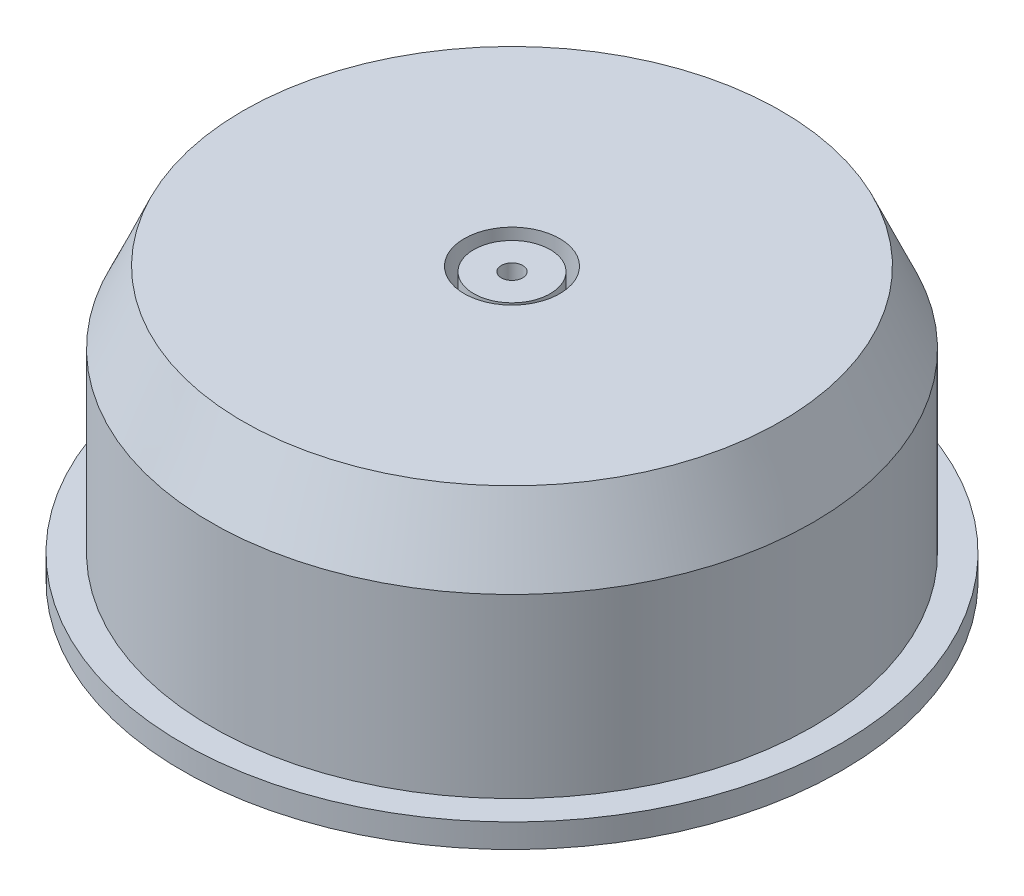
ISO-10303-21;
HEADER;
FILE_DESCRIPTION(('STEP AP214'),'2;1');
FILE_NAME('part.step','',(''),(''),'','','');
FILE_SCHEMA(('AUTOMOTIVE_DESIGN { 1 0 10303 214 1 1 1 1 }'));
ENDSEC;
DATA;
#1=APPLICATION_CONTEXT('core data for automotive mechanical design processes');
#2=APPLICATION_PROTOCOL_DEFINITION('international standard','automotive_design',2000,#1);
#3=PRODUCT_CONTEXT('',#1,'mechanical');
#4=PRODUCT('Part','Part','',(#3));
#5=PRODUCT_RELATED_PRODUCT_CATEGORY('part','',(#4));
#6=PRODUCT_DEFINITION_FORMATION('','',#4);
#7=PRODUCT_DEFINITION_CONTEXT('part definition',#1,'design');
#8=PRODUCT_DEFINITION('design','',#6,#7);
#9=PRODUCT_DEFINITION_SHAPE('','',#8);
#10=(LENGTH_UNIT() NAMED_UNIT(*) SI_UNIT(.MILLI.,.METRE.));
#11=(NAMED_UNIT(*) PLANE_ANGLE_UNIT() SI_UNIT($,.RADIAN.));
#12=(NAMED_UNIT(*) SI_UNIT($,.STERADIAN.) SOLID_ANGLE_UNIT());
#13=UNCERTAINTY_MEASURE_WITH_UNIT(LENGTH_MEASURE(1.E-05),#10,'distance_accuracy_value','');
#14=(GEOMETRIC_REPRESENTATION_CONTEXT(3) GLOBAL_UNCERTAINTY_ASSIGNED_CONTEXT((#13)) GLOBAL_UNIT_ASSIGNED_CONTEXT((#10,
#11,#12)) REPRESENTATION_CONTEXT('',''));
#15=CARTESIAN_POINT('',(0.,0.,0.));
#16=DIRECTION('',(0.,0.,1.));
#17=DIRECTION('',(1.,0.,0.));
#18=AXIS2_PLACEMENT_3D('',#15,#16,#17);
#19=CARTESIAN_POINT('',(0.,-1.97824676932213,0.));
#20=DIRECTION('',(0.,-1.,0.));
#21=DIRECTION('',(1.,0.,0.));
#22=AXIS2_PLACEMENT_3D('',#19,#20,#21);
#23=CONICAL_SURFACE('',#22,56.3333333333333,0.418224329579229);
#24=CARTESIAN_POINT('',(0.,-16.9782467693221,0.));
#25=DIRECTION('',(0.,1.,0.));
#26=DIRECTION('',(-1.,0.,0.));
#27=AXIS2_PLACEMENT_3D('',#24,#25,#26);
#28=CIRCLE('',#27,63.);
#29=CARTESIAN_POINT('',(-63.,-16.9782467693221,0.));
#30=VERTEX_POINT('',#29);
#31=EDGE_CURVE('E198',#30,#30,#28,.T.);
#32=ORIENTED_EDGE('',*,*,#31,.T.);
#33=EDGE_LOOP('',(#32));
#34=FACE_BOUND('',#33,.T.);
#35=CARTESIAN_POINT('',(0.,-1.97824676932213,0.));
#36=DIRECTION('',(0.,1.,0.));
#37=DIRECTION('',(-1.,0.,0.));
#38=AXIS2_PLACEMENT_3D('',#35,#36,#37);
#39=CIRCLE('',#38,56.3333333333333);
#40=CARTESIAN_POINT('',(-56.3333333333333,-1.97824676932213,0.));
#41=VERTEX_POINT('',#40);
#42=EDGE_CURVE('E168',#41,#41,#39,.T.);
#43=ORIENTED_EDGE('',*,*,#42,.F.);
#44=EDGE_LOOP('',(#43));
#45=FACE_BOUND('',#44,.T.);
#46=ADVANCED_FACE('F38',(#34,#45),#23,.T.);
#47=CARTESIAN_POINT('',(0.,-2.97824676932212,0.));
#48=DIRECTION('',(0.,1.,0.));
#49=DIRECTION('',(-1.,0.,0.));
#50=AXIS2_PLACEMENT_3D('',#47,#48,#49);
#51=CYLINDRICAL_SURFACE('',#50,63.);
#52=CARTESIAN_POINT('',(0.,-53.9782467693221,0.));
#53=DIRECTION('',(0.,1.,0.));
#54=DIRECTION('',(-1.,0.,0.));
#55=AXIS2_PLACEMENT_3D('',#52,#53,#54);
#56=CIRCLE('',#55,63.);
#57=CARTESIAN_POINT('',(-63.,-53.9782467693221,0.));
#58=VERTEX_POINT('',#57);
#59=EDGE_CURVE('E195',#58,#58,#56,.T.);
#60=ORIENTED_EDGE('',*,*,#59,.T.);
#61=EDGE_LOOP('',(#60));
#62=FACE_BOUND('',#61,.T.);
#63=ORIENTED_EDGE('',*,*,#31,.F.);
#64=EDGE_LOOP('',(#63));
#65=FACE_BOUND('',#64,.T.);
#66=ADVANCED_FACE('F220',(#62,#65),#51,.T.);
#67=CARTESIAN_POINT('',(-63.,-53.9782467693221,0.));
#68=DIRECTION('',(0.,1.,0.));
#69=DIRECTION('',(-1.,0.,0.));
#70=AXIS2_PLACEMENT_3D('',#67,#68,#69);
#71=PLANE('',#70);
#72=CARTESIAN_POINT('',(0.,-53.9782467693221,0.));
#73=DIRECTION('',(0.,1.,0.));
#74=DIRECTION('',(-1.,0.,0.));
#75=AXIS2_PLACEMENT_3D('',#72,#73,#74);
#76=CIRCLE('',#75,69.);
#77=CARTESIAN_POINT('',(-69.,-53.9782467693221,0.));
#78=VERTEX_POINT('',#77);
#79=EDGE_CURVE('E192',#78,#78,#76,.T.);
#80=ORIENTED_EDGE('',*,*,#79,.T.);
#81=EDGE_LOOP('',(#80));
#82=FACE_BOUND('',#81,.T.);
#83=ORIENTED_EDGE('',*,*,#59,.F.);
#84=EDGE_LOOP('',(#83));
#85=FACE_BOUND('',#84,.T.);
#86=ADVANCED_FACE('F225',(#82,#85),#71,.T.);
#87=CARTESIAN_POINT('',(0.,-2.97824676932212,0.));
#88=DIRECTION('',(0.,1.,0.));
#89=DIRECTION('',(-1.,0.,0.));
#90=AXIS2_PLACEMENT_3D('',#87,#88,#89);
#91=CYLINDRICAL_SURFACE('',#90,69.);
#92=CARTESIAN_POINT('',(0.,-58.9782467693221,0.));
#93=DIRECTION('',(0.,1.,0.));
#94=DIRECTION('',(-1.,0.,0.));
#95=AXIS2_PLACEMENT_3D('',#92,#93,#94);
#96=CIRCLE('',#95,69.);
#97=CARTESIAN_POINT('',(-69.,-58.9782467693221,0.));
#98=VERTEX_POINT('',#97);
#99=EDGE_CURVE('E189',#98,#98,#96,.T.);
#100=ORIENTED_EDGE('',*,*,#99,.T.);
#101=EDGE_LOOP('',(#100));
#102=FACE_BOUND('',#101,.T.);
#103=ORIENTED_EDGE('',*,*,#79,.F.);
#104=EDGE_LOOP('',(#103));
#105=FACE_BOUND('',#104,.T.);
#106=ADVANCED_FACE('F275',(#102,#105),#91,.T.);
#107=CARTESIAN_POINT('',(-69.,-58.9782467693221,0.));
#108=DIRECTION('',(0.,-1.,0.));
#109=DIRECTION('',(1.,0.,0.));
#110=AXIS2_PLACEMENT_3D('',#107,#108,#109);
#111=PLANE('',#110);
#112=CARTESIAN_POINT('',(51.3826826033579,-58.9782467693221,-31.0025831017987));
#113=DIRECTION('',(0.,-1.,0.));
#114=DIRECTION('',(0.,0.,-1.));
#115=AXIS2_PLACEMENT_3D('',#112,#113,#114);
#116=CIRCLE('',#115,5.2);
#117=CARTESIAN_POINT('',(51.3826826033579,-58.9782467693221,-36.2025831017987));
#118=VERTEX_POINT('',#117);
#119=EDGE_CURVE('E94',#118,#118,#116,.T.);
#120=ORIENTED_EDGE('',*,*,#119,.F.);
#121=EDGE_LOOP('',(#120));
#122=FACE_BOUND('',#121,.T.);
#123=CARTESIAN_POINT('',(52.5403658507747,-58.9782467693221,28.9974168982014));
#124=DIRECTION('',(0.,-1.,0.));
#125=DIRECTION('',(0.,0.,-1.));
#126=AXIS2_PLACEMENT_3D('',#123,#124,#125);
#127=CIRCLE('',#126,5.2);
#128=CARTESIAN_POINT('',(52.5403658507747,-58.9782467693221,23.7974168982014));
#129=VERTEX_POINT('',#128);
#130=EDGE_CURVE('E110',#129,#129,#127,.T.);
#131=ORIENTED_EDGE('',*,*,#130,.F.);
#132=EDGE_LOOP('',(#131));
#133=FACE_BOUND('',#132,.T.);
#134=CARTESIAN_POINT('',(1.15768324741619,-58.9782467693221,60.));
#135=DIRECTION('',(0.,-1.,0.));
#136=DIRECTION('',(0.,0.,-1.));
#137=AXIS2_PLACEMENT_3D('',#134,#135,#136);
#138=CIRCLE('',#137,5.2);
#139=CARTESIAN_POINT('',(1.15768324741619,-58.9782467693221,54.8));
#140=VERTEX_POINT('',#139);
#141=EDGE_CURVE('E119',#140,#140,#138,.T.);
#142=ORIENTED_EDGE('',*,*,#141,.F.);
#143=EDGE_LOOP('',(#142));
#144=FACE_BOUND('',#143,.T.);
#145=CARTESIAN_POINT('',(-51.3826826033581,-58.9782467693221,31.0025831017983));
#146=DIRECTION('',(0.,-1.,0.));
#147=DIRECTION('',(0.,0.,-1.));
#148=AXIS2_PLACEMENT_3D('',#145,#146,#147);
#149=CIRCLE('',#148,5.2);
#150=CARTESIAN_POINT('',(-51.3826826033581,-58.9782467693221,25.8025831017983));
#151=VERTEX_POINT('',#150);
#152=EDGE_CURVE('E128',#151,#151,#149,.T.);
#153=ORIENTED_EDGE('',*,*,#152,.F.);
#154=EDGE_LOOP('',(#153));
#155=FACE_BOUND('',#154,.T.);
#156=CARTESIAN_POINT('',(-52.5403658507745,-58.9782467693221,-28.9974168982018));
#157=DIRECTION('',(0.,-1.,0.));
#158=DIRECTION('',(0.,0.,-1.));
#159=AXIS2_PLACEMENT_3D('',#156,#157,#158);
#160=CIRCLE('',#159,5.2);
#161=CARTESIAN_POINT('',(-52.5403658507745,-58.9782467693221,-34.1974168982018));
#162=VERTEX_POINT('',#161);
#163=EDGE_CURVE('E137',#162,#162,#160,.T.);
#164=ORIENTED_EDGE('',*,*,#163,.F.);
#165=EDGE_LOOP('',(#164));
#166=FACE_BOUND('',#165,.T.);
#167=CARTESIAN_POINT('',(-1.15768324741619,-58.9782467693221,-60.));
#168=DIRECTION('',(0.,-1.,0.));
#169=DIRECTION('',(0.,0.,-1.));
#170=AXIS2_PLACEMENT_3D('',#167,#168,#169);
#171=CIRCLE('',#170,5.2);
#172=CARTESIAN_POINT('',(-1.15768324741619,-58.9782467693221,-65.2));
#173=VERTEX_POINT('',#172);
#174=EDGE_CURVE('E146',#173,#173,#171,.T.);
#175=ORIENTED_EDGE('',*,*,#174,.F.);
#176=EDGE_LOOP('',(#175));
#177=FACE_BOUND('',#176,.T.);
#178=CARTESIAN_POINT('',(0.,-58.9782467693221,0.));
#179=DIRECTION('',(0.,1.,0.));
#180=DIRECTION('',(-1.,0.,0.));
#181=AXIS2_PLACEMENT_3D('',#178,#179,#180);
#182=CIRCLE('',#181,34.2989447690252);
#183=CARTESIAN_POINT('',(-34.2989447690252,-58.9782467693221,0.));
#184=VERTEX_POINT('',#183);
#185=EDGE_CURVE('E186',#184,#184,#182,.T.);
#186=ORIENTED_EDGE('',*,*,#185,.T.);
#187=EDGE_LOOP('',(#186));
#188=FACE_BOUND('',#187,.T.);
#189=ORIENTED_EDGE('',*,*,#99,.F.);
#190=EDGE_LOOP('',(#189));
#191=FACE_BOUND('',#190,.T.);
#192=ADVANCED_FACE('F271',(#122,#133,#144,#155,#166,#177,#188,#191),#111,.T.);
#193=CARTESIAN_POINT('',(0.,-58.9782467693221,0.));
#194=DIRECTION('',(0.,1.,0.));
#195=DIRECTION('',(-1.,0.,0.));
#196=AXIS2_PLACEMENT_3D('',#193,#194,#195);
#197=CONICAL_SURFACE('',#196,34.2989447690252,1.15257199721567);
#198=CARTESIAN_POINT('',(0.,-62.9782467693221,0.));
#199=DIRECTION('',(0.,1.,0.));
#200=DIRECTION('',(-1.,0.,0.));
#201=AXIS2_PLACEMENT_3D('',#198,#199,#200);
#202=CIRCLE('',#201,25.2989447690253);
#203=CARTESIAN_POINT('',(-25.2989447690253,-62.9782467693221,0.));
#204=VERTEX_POINT('',#203);
#205=EDGE_CURVE('E183',#204,#204,#202,.T.);
#206=ORIENTED_EDGE('',*,*,#205,.T.);
#207=EDGE_LOOP('',(#206));
#208=FACE_BOUND('',#207,.T.);
#209=ORIENTED_EDGE('',*,*,#185,.F.);
#210=EDGE_LOOP('',(#209));
#211=FACE_BOUND('',#210,.T.);
#212=ADVANCED_FACE('F264',(#208,#211),#197,.T.);
#213=CARTESIAN_POINT('',(-25.2989447690253,-62.9782467693221,0.));
#214=DIRECTION('',(0.,-1.,0.));
#215=DIRECTION('',(1.,0.,0.));
#216=AXIS2_PLACEMENT_3D('',#213,#214,#215);
#217=PLANE('',#216);
#218=CARTESIAN_POINT('',(0.,-62.9782467693221,0.));
#219=DIRECTION('',(0.,-1.,0.));
#220=DIRECTION('',(1.,0.,0.));
#221=AXIS2_PLACEMENT_3D('',#218,#219,#220);
#222=CIRCLE('',#221,9.95061624033845);
#223=CARTESIAN_POINT('',(9.95061624033846,-62.9782467693221,0.));
#224=VERTEX_POINT('',#223);
#225=EDGE_CURVE('E750',#224,#224,#222,.T.);
#226=ORIENTED_EDGE('',*,*,#225,.F.);
#227=EDGE_LOOP('',(#226));
#228=FACE_BOUND('',#227,.T.);
#229=ORIENTED_EDGE('',*,*,#205,.F.);
#230=EDGE_LOOP('',(#229));
#231=FACE_BOUND('',#230,.T.);
#232=ADVANCED_FACE('F258',(#228,#231),#217,.T.);
#233=CARTESIAN_POINT('',(0.,-2.97824676932212,0.));
#234=DIRECTION('',(0.,1.,0.));
#235=DIRECTION('',(-1.,0.,0.));
#236=AXIS2_PLACEMENT_3D('',#233,#234,#235);
#237=PLANE('',#236);
#238=CARTESIAN_POINT('',(0.,-2.97824676932212,0.));
#239=DIRECTION('',(0.,1.,0.));
#240=DIRECTION('',(0.,0.,1.));
#241=AXIS2_PLACEMENT_3D('',#238,#239,#240);
#242=CIRCLE('',#241,2.25);
#243=CARTESIAN_POINT('',(0.,-2.97824676932212,2.25));
#244=VERTEX_POINT('',#243);
#245=EDGE_CURVE('E95',#244,#244,#242,.T.);
#246=ORIENTED_EDGE('',*,*,#245,.F.);
#247=EDGE_LOOP('',(#246));
#248=FACE_BOUND('',#247,.T.);
#249=CARTESIAN_POINT('',(0.,-2.97824676932212,0.));
#250=DIRECTION('',(0.,1.,0.));
#251=DIRECTION('',(-1.,0.,0.));
#252=AXIS2_PLACEMENT_3D('',#249,#250,#251);
#253=CIRCLE('',#252,8.);
#254=CARTESIAN_POINT('',(-8.,-2.97824676932212,0.));
#255=VERTEX_POINT('',#254);
#256=EDGE_CURVE('E180',#255,#255,#253,.T.);
#257=ORIENTED_EDGE('',*,*,#256,.T.);
#258=EDGE_LOOP('',(#257));
#259=FACE_BOUND('',#258,.T.);
#260=ADVANCED_FACE('F253',(#248,#259),#237,.T.);
#261=CARTESIAN_POINT('',(0.,-2.97824676932212,0.));
#262=DIRECTION('',(0.,1.,0.));
#263=DIRECTION('',(-1.,0.,0.));
#264=AXIS2_PLACEMENT_3D('',#261,#262,#263);
#265=CYLINDRICAL_SURFACE('',#264,8.);
#266=CARTESIAN_POINT('',(0.,-13.7305910328104,0.));
#267=DIRECTION('',(0.,1.,0.));
#268=DIRECTION('',(-1.,0.,0.));
#269=AXIS2_PLACEMENT_3D('',#266,#267,#268);
#270=CIRCLE('',#269,8.);
#271=CARTESIAN_POINT('',(-8.,-13.7305910328104,0.));
#272=VERTEX_POINT('',#271);
#273=EDGE_CURVE('E177',#272,#272,#270,.T.);
#274=ORIENTED_EDGE('',*,*,#273,.T.);
#275=EDGE_LOOP('',(#274));
#276=FACE_BOUND('',#275,.T.);
#277=ORIENTED_EDGE('',*,*,#256,.F.);
#278=EDGE_LOOP('',(#277));
#279=FACE_BOUND('',#278,.T.);
#280=ADVANCED_FACE('F247',(#276,#279),#265,.T.);
#281=CARTESIAN_POINT('',(-8.,-13.7305910328104,0.));
#282=DIRECTION('',(0.,1.,0.));
#283=DIRECTION('',(-1.,0.,0.));
#284=AXIS2_PLACEMENT_3D('',#281,#282,#283);
#285=PLANE('',#284);
#286=CARTESIAN_POINT('',(0.,-13.7305910328104,0.));
#287=DIRECTION('',(0.,1.,0.));
#288=DIRECTION('',(-1.,0.,0.));
#289=AXIS2_PLACEMENT_3D('',#286,#287,#288);
#290=CIRCLE('',#289,10.);
#291=CARTESIAN_POINT('',(-10.,-13.7305910328104,0.));
#292=VERTEX_POINT('',#291);
#293=EDGE_CURVE('E174',#292,#292,#290,.T.);
#294=ORIENTED_EDGE('',*,*,#293,.T.);
#295=EDGE_LOOP('',(#294));
#296=FACE_BOUND('',#295,.T.);
#297=ORIENTED_EDGE('',*,*,#273,.F.);
#298=EDGE_LOOP('',(#297));
#299=FACE_BOUND('',#298,.T.);
#300=ADVANCED_FACE('F241',(#296,#299),#285,.T.);
#301=CARTESIAN_POINT('',(0.,-2.97824676932212,0.));
#302=DIRECTION('',(0.,1.,0.));
#303=DIRECTION('',(-1.,0.,0.));
#304=AXIS2_PLACEMENT_3D('',#301,#302,#303);
#305=CYLINDRICAL_SURFACE('',#304,10.);
#306=CARTESIAN_POINT('',(0.,-1.97824676932212,0.));
#307=DIRECTION('',(0.,1.,0.));
#308=DIRECTION('',(-1.,0.,0.));
#309=AXIS2_PLACEMENT_3D('',#306,#307,#308);
#310=CIRCLE('',#309,10.);
#311=CARTESIAN_POINT('',(-10.,-1.97824676932212,0.));
#312=VERTEX_POINT('',#311);
#313=EDGE_CURVE('E171',#312,#312,#310,.T.);
#314=ORIENTED_EDGE('',*,*,#313,.T.);
#315=EDGE_LOOP('',(#314));
#316=FACE_BOUND('',#315,.T.);
#317=ORIENTED_EDGE('',*,*,#293,.F.);
#318=EDGE_LOOP('',(#317));
#319=FACE_BOUND('',#318,.T.);
#320=ADVANCED_FACE('F235',(#316,#319),#305,.F.);
#321=CARTESIAN_POINT('',(-10.,-1.97824676932213,0.));
#322=DIRECTION('',(0.,1.,0.));
#323=DIRECTION('',(-1.,0.,0.));
#324=AXIS2_PLACEMENT_3D('',#321,#322,#323);
#325=PLANE('',#324);
#326=ORIENTED_EDGE('',*,*,#42,.T.);
#327=EDGE_LOOP('',(#326));
#328=FACE_BOUND('',#327,.T.);
#329=ORIENTED_EDGE('',*,*,#313,.F.);
#330=EDGE_LOOP('',(#329));
#331=FACE_BOUND('',#330,.T.);
#332=ADVANCED_FACE('F231',(#328,#331),#325,.T.);
#333=CARTESIAN_POINT('',(-1.15768324741619,-44.9782467693221,-60.));
#334=DIRECTION('',(0.,-1.,0.));
#335=DIRECTION('',(0.,0.,-1.));
#336=AXIS2_PLACEMENT_3D('',#333,#334,#335);
#337=CONICAL_SURFACE('',#336,2.74999999999999,1.02974425867665);
#338=CARTESIAN_POINT('',(-1.15768324741619,-43.3258800669963,-60.));
#339=VERTEX_POINT('',#338);
#340=VERTEX_LOOP('',#339);
#341=FACE_BOUND('',#340,.T.);
#342=CARTESIAN_POINT('',(-1.15768324741619,-44.9782467693221,-60.));
#343=DIRECTION('',(0.,-1.,0.));
#344=DIRECTION('',(0.,0.,-1.));
#345=AXIS2_PLACEMENT_3D('',#342,#343,#344);
#346=CIRCLE('',#345,2.74999999999999);
#347=CARTESIAN_POINT('',(-1.15768324741619,-44.9782467693221,-62.75));
#348=VERTEX_POINT('',#347);
#349=EDGE_CURVE('E152',#348,#348,#346,.T.);
#350=ORIENTED_EDGE('',*,*,#349,.T.);
#351=EDGE_LOOP('',(#350));
#352=FACE_BOUND('',#351,.T.);
#353=ADVANCED_FACE('F234',(#341,#352),#337,.F.);
#354=CARTESIAN_POINT('',(-1.15768324741619,-58.9782467693221,-60.));
#355=DIRECTION('',(0.,-1.,0.));
#356=DIRECTION('',(0.,0.,-1.));
#357=AXIS2_PLACEMENT_3D('',#354,#355,#356);
#358=CYLINDRICAL_SURFACE('',#357,2.74999999999999);
#359=ORIENTED_EDGE('',*,*,#349,.F.);
#360=EDGE_LOOP('',(#359));
#361=FACE_BOUND('',#360,.T.);
#362=CARTESIAN_POINT('',(-1.15768324741619,-56.5282467693221,-60.));
#363=DIRECTION('',(0.,-1.,0.));
#364=DIRECTION('',(0.,0.,-1.));
#365=AXIS2_PLACEMENT_3D('',#362,#363,#364);
#366=CIRCLE('',#365,2.75);
#367=CARTESIAN_POINT('',(-1.15768324741619,-56.5282467693221,-62.75));
#368=VERTEX_POINT('',#367);
#369=EDGE_CURVE('E149',#368,#368,#366,.T.);
#370=ORIENTED_EDGE('',*,*,#369,.T.);
#371=EDGE_LOOP('',(#370));
#372=FACE_BOUND('',#371,.T.);
#373=ADVANCED_FACE('F412',(#361,#372),#358,.F.);
#374=CARTESIAN_POINT('',(-1.15768324741619,-58.9782467693221,-60.));
#375=DIRECTION('',(0.,-1.,0.));
#376=DIRECTION('',(0.,0.,-1.));
#377=AXIS2_PLACEMENT_3D('',#374,#375,#376);
#378=CONICAL_SURFACE('',#377,5.2,0.785398163397449);
#379=ORIENTED_EDGE('',*,*,#369,.F.);
#380=EDGE_LOOP('',(#379));
#381=FACE_BOUND('',#380,.T.);
#382=ORIENTED_EDGE('',*,*,#174,.T.);
#383=EDGE_LOOP('',(#382));
#384=FACE_BOUND('',#383,.T.);
#385=ADVANCED_FACE('F423',(#381,#384),#378,.F.);
#386=CARTESIAN_POINT('',(-52.5403658507745,-44.9782467693221,-28.9974168982018));
#387=DIRECTION('',(0.,-1.,0.));
#388=DIRECTION('',(0.,0.,-1.));
#389=AXIS2_PLACEMENT_3D('',#386,#387,#388);
#390=CONICAL_SURFACE('',#389,2.74999999999999,1.02974425867665);
#391=CARTESIAN_POINT('',(-52.5403658507745,-43.3258800669963,-28.9974168982018));
#392=VERTEX_POINT('',#391);
#393=VERTEX_LOOP('',#392);
#394=FACE_BOUND('',#393,.T.);
#395=CARTESIAN_POINT('',(-52.5403658507745,-44.9782467693221,-28.9974168982018));
#396=DIRECTION('',(0.,-1.,0.));
#397=DIRECTION('',(0.,0.,-1.));
#398=AXIS2_PLACEMENT_3D('',#395,#396,#397);
#399=CIRCLE('',#398,2.74999999999999);
#400=CARTESIAN_POINT('',(-52.5403658507745,-44.9782467693221,-31.7474168982018));
#401=VERTEX_POINT('',#400);
#402=EDGE_CURVE('E143',#401,#401,#399,.T.);
#403=ORIENTED_EDGE('',*,*,#402,.T.);
#404=EDGE_LOOP('',(#403));
#405=FACE_BOUND('',#404,.T.);
#406=ADVANCED_FACE('F433',(#394,#405),#390,.F.);
#407=CARTESIAN_POINT('',(-52.5403658507745,-58.9782467693221,-28.9974168982018));
#408=DIRECTION('',(0.,-1.,0.));
#409=DIRECTION('',(0.,0.,-1.));
#410=AXIS2_PLACEMENT_3D('',#407,#408,#409);
#411=CYLINDRICAL_SURFACE('',#410,2.74999999999999);
#412=ORIENTED_EDGE('',*,*,#402,.F.);
#413=EDGE_LOOP('',(#412));
#414=FACE_BOUND('',#413,.T.);
#415=CARTESIAN_POINT('',(-52.5403658507745,-56.5282467693221,-28.9974168982018));
#416=DIRECTION('',(0.,-1.,0.));
#417=DIRECTION('',(0.,0.,-1.));
#418=AXIS2_PLACEMENT_3D('',#415,#416,#417);
#419=CIRCLE('',#418,2.75);
#420=CARTESIAN_POINT('',(-52.5403658507745,-56.5282467693221,-31.7474168982018));
#421=VERTEX_POINT('',#420);
#422=EDGE_CURVE('E140',#421,#421,#419,.T.);
#423=ORIENTED_EDGE('',*,*,#422,.T.);
#424=EDGE_LOOP('',(#423));
#425=FACE_BOUND('',#424,.T.);
#426=ADVANCED_FACE('F443',(#414,#425),#411,.F.);
#427=CARTESIAN_POINT('',(-52.5403658507745,-58.9782467693221,-28.9974168982018));
#428=DIRECTION('',(0.,-1.,0.));
#429=DIRECTION('',(0.,0.,-1.));
#430=AXIS2_PLACEMENT_3D('',#427,#428,#429);
#431=CONICAL_SURFACE('',#430,5.2,0.78539816339745);
#432=ORIENTED_EDGE('',*,*,#422,.F.);
#433=EDGE_LOOP('',(#432));
#434=FACE_BOUND('',#433,.T.);
#435=ORIENTED_EDGE('',*,*,#163,.T.);
#436=EDGE_LOOP('',(#435));
#437=FACE_BOUND('',#436,.T.);
#438=ADVANCED_FACE('F454',(#434,#437),#431,.F.);
#439=CARTESIAN_POINT('',(-51.3826826033581,-44.9782467693221,31.0025831017983));
#440=DIRECTION('',(0.,-1.,0.));
#441=DIRECTION('',(0.,0.,-1.));
#442=AXIS2_PLACEMENT_3D('',#439,#440,#441);
#443=CONICAL_SURFACE('',#442,2.74999999999999,1.02974425867665);
#444=CARTESIAN_POINT('',(-51.3826826033581,-43.3258800669963,31.0025831017983));
#445=VERTEX_POINT('',#444);
#446=VERTEX_LOOP('',#445);
#447=FACE_BOUND('',#446,.T.);
#448=CARTESIAN_POINT('',(-51.3826826033581,-44.9782467693221,31.0025831017983));
#449=DIRECTION('',(0.,-1.,0.));
#450=DIRECTION('',(0.,0.,-1.));
#451=AXIS2_PLACEMENT_3D('',#448,#449,#450);
#452=CIRCLE('',#451,2.74999999999999);
#453=CARTESIAN_POINT('',(-51.3826826033581,-44.9782467693221,28.2525831017983));
#454=VERTEX_POINT('',#453);
#455=EDGE_CURVE('E134',#454,#454,#452,.T.);
#456=ORIENTED_EDGE('',*,*,#455,.T.);
#457=EDGE_LOOP('',(#456));
#458=FACE_BOUND('',#457,.T.);
#459=ADVANCED_FACE('F465',(#447,#458),#443,.F.);
#460=CARTESIAN_POINT('',(-51.3826826033581,-58.9782467693221,31.0025831017983));
#461=DIRECTION('',(0.,-1.,0.));
#462=DIRECTION('',(0.,0.,-1.));
#463=AXIS2_PLACEMENT_3D('',#460,#461,#462);
#464=CYLINDRICAL_SURFACE('',#463,2.74999999999999);
#465=ORIENTED_EDGE('',*,*,#455,.F.);
#466=EDGE_LOOP('',(#465));
#467=FACE_BOUND('',#466,.T.);
#468=CARTESIAN_POINT('',(-51.3826826033581,-56.5282467693221,31.0025831017983));
#469=DIRECTION('',(0.,-1.,0.));
#470=DIRECTION('',(0.,0.,-1.));
#471=AXIS2_PLACEMENT_3D('',#468,#469,#470);
#472=CIRCLE('',#471,2.75);
#473=CARTESIAN_POINT('',(-51.3826826033581,-56.5282467693221,28.2525831017983));
#474=VERTEX_POINT('',#473);
#475=EDGE_CURVE('E131',#474,#474,#472,.T.);
#476=ORIENTED_EDGE('',*,*,#475,.T.);
#477=EDGE_LOOP('',(#476));
#478=FACE_BOUND('',#477,.T.);
#479=ADVANCED_FACE('F476',(#467,#478),#464,.F.);
#480=CARTESIAN_POINT('',(-51.3826826033581,-58.9782467693221,31.0025831017983));
#481=DIRECTION('',(0.,-1.,0.));
#482=DIRECTION('',(0.,0.,-1.));
#483=AXIS2_PLACEMENT_3D('',#480,#481,#482);
#484=CONICAL_SURFACE('',#483,5.2,0.785398163397448);
#485=ORIENTED_EDGE('',*,*,#475,.F.);
#486=EDGE_LOOP('',(#485));
#487=FACE_BOUND('',#486,.T.);
#488=ORIENTED_EDGE('',*,*,#152,.T.);
#489=EDGE_LOOP('',(#488));
#490=FACE_BOUND('',#489,.T.);
#491=ADVANCED_FACE('F487',(#487,#490),#484,.F.);
#492=CARTESIAN_POINT('',(1.15768324741619,-44.9782467693221,60.));
#493=DIRECTION('',(0.,-1.,0.));
#494=DIRECTION('',(0.,0.,-1.));
#495=AXIS2_PLACEMENT_3D('',#492,#493,#494);
#496=CONICAL_SURFACE('',#495,2.74999999999999,1.02974425867665);
#497=CARTESIAN_POINT('',(1.15768324741619,-43.3258800669963,60.));
#498=VERTEX_POINT('',#497);
#499=VERTEX_LOOP('',#498);
#500=FACE_BOUND('',#499,.T.);
#501=CARTESIAN_POINT('',(1.15768324741619,-44.9782467693221,60.));
#502=DIRECTION('',(0.,-1.,0.));
#503=DIRECTION('',(0.,0.,-1.));
#504=AXIS2_PLACEMENT_3D('',#501,#502,#503);
#505=CIRCLE('',#504,2.74999999999999);
#506=CARTESIAN_POINT('',(1.15768324741619,-44.9782467693221,57.25));
#507=VERTEX_POINT('',#506);
#508=EDGE_CURVE('E125',#507,#507,#505,.T.);
#509=ORIENTED_EDGE('',*,*,#508,.T.);
#510=EDGE_LOOP('',(#509));
#511=FACE_BOUND('',#510,.T.);
#512=ADVANCED_FACE('F498',(#500,#511),#496,.F.);
#513=CARTESIAN_POINT('',(1.15768324741619,-58.9782467693221,60.));
#514=DIRECTION('',(0.,-1.,0.));
#515=DIRECTION('',(0.,0.,-1.));
#516=AXIS2_PLACEMENT_3D('',#513,#514,#515);
#517=CYLINDRICAL_SURFACE('',#516,2.74999999999999);
#518=ORIENTED_EDGE('',*,*,#508,.F.);
#519=EDGE_LOOP('',(#518));
#520=FACE_BOUND('',#519,.T.);
#521=CARTESIAN_POINT('',(1.15768324741619,-56.5282467693221,60.));
#522=DIRECTION('',(0.,-1.,0.));
#523=DIRECTION('',(0.,0.,-1.));
#524=AXIS2_PLACEMENT_3D('',#521,#522,#523);
#525=CIRCLE('',#524,2.75);
#526=CARTESIAN_POINT('',(1.15768324741619,-56.5282467693221,57.25));
#527=VERTEX_POINT('',#526);
#528=EDGE_CURVE('E122',#527,#527,#525,.T.);
#529=ORIENTED_EDGE('',*,*,#528,.T.);
#530=EDGE_LOOP('',(#529));
#531=FACE_BOUND('',#530,.T.);
#532=ADVANCED_FACE('F509',(#520,#531),#517,.F.);
#533=CARTESIAN_POINT('',(1.15768324741619,-58.9782467693221,60.));
#534=DIRECTION('',(0.,-1.,0.));
#535=DIRECTION('',(0.,0.,-1.));
#536=AXIS2_PLACEMENT_3D('',#533,#534,#535);
#537=CONICAL_SURFACE('',#536,5.2,0.785398163397449);
#538=ORIENTED_EDGE('',*,*,#528,.F.);
#539=EDGE_LOOP('',(#538));
#540=FACE_BOUND('',#539,.T.);
#541=ORIENTED_EDGE('',*,*,#141,.T.);
#542=EDGE_LOOP('',(#541));
#543=FACE_BOUND('',#542,.T.);
#544=ADVANCED_FACE('F520',(#540,#543),#537,.F.);
#545=CARTESIAN_POINT('',(52.5403658507747,-44.9782467693221,28.9974168982014));
#546=DIRECTION('',(0.,-1.,0.));
#547=DIRECTION('',(0.,0.,-1.));
#548=AXIS2_PLACEMENT_3D('',#545,#546,#547);
#549=CONICAL_SURFACE('',#548,2.74999999999999,1.02974425867665);
#550=CARTESIAN_POINT('',(52.5403658507747,-43.3258800669963,28.9974168982014));
#551=VERTEX_POINT('',#550);
#552=VERTEX_LOOP('',#551);
#553=FACE_BOUND('',#552,.T.);
#554=CARTESIAN_POINT('',(52.5403658507747,-44.9782467693221,28.9974168982014));
#555=DIRECTION('',(0.,-1.,0.));
#556=DIRECTION('',(0.,0.,-1.));
#557=AXIS2_PLACEMENT_3D('',#554,#555,#556);
#558=CIRCLE('',#557,2.74999999999999);
#559=CARTESIAN_POINT('',(52.5403658507747,-44.9782467693221,26.2474168982014));
#560=VERTEX_POINT('',#559);
#561=EDGE_CURVE('E116',#560,#560,#558,.T.);
#562=ORIENTED_EDGE('',*,*,#561,.T.);
#563=EDGE_LOOP('',(#562));
#564=FACE_BOUND('',#563,.T.);
#565=ADVANCED_FACE('F531',(#553,#564),#549,.F.);
#566=CARTESIAN_POINT('',(52.5403658507747,-58.9782467693221,28.9974168982014));
#567=DIRECTION('',(0.,-1.,0.));
#568=DIRECTION('',(0.,0.,-1.));
#569=AXIS2_PLACEMENT_3D('',#566,#567,#568);
#570=CYLINDRICAL_SURFACE('',#569,2.74999999999999);
#571=ORIENTED_EDGE('',*,*,#561,.F.);
#572=EDGE_LOOP('',(#571));
#573=FACE_BOUND('',#572,.T.);
#574=CARTESIAN_POINT('',(52.5403658507747,-56.5282467693221,28.9974168982014));
#575=DIRECTION('',(0.,-1.,0.));
#576=DIRECTION('',(0.,0.,-1.));
#577=AXIS2_PLACEMENT_3D('',#574,#575,#576);
#578=CIRCLE('',#577,2.75);
#579=CARTESIAN_POINT('',(52.5403658507747,-56.5282467693221,26.2474168982014));
#580=VERTEX_POINT('',#579);
#581=EDGE_CURVE('E113',#580,#580,#578,.T.);
#582=ORIENTED_EDGE('',*,*,#581,.T.);
#583=EDGE_LOOP('',(#582));
#584=FACE_BOUND('',#583,.T.);
#585=ADVANCED_FACE('F542',(#573,#584),#570,.F.);
#586=CARTESIAN_POINT('',(52.5403658507747,-58.9782467693221,28.9974168982014));
#587=DIRECTION('',(0.,-1.,0.));
#588=DIRECTION('',(0.,0.,-1.));
#589=AXIS2_PLACEMENT_3D('',#586,#587,#588);
#590=CONICAL_SURFACE('',#589,5.2,0.78539816339745);
#591=ORIENTED_EDGE('',*,*,#581,.F.);
#592=EDGE_LOOP('',(#591));
#593=FACE_BOUND('',#592,.T.);
#594=ORIENTED_EDGE('',*,*,#130,.T.);
#595=EDGE_LOOP('',(#594));
#596=FACE_BOUND('',#595,.T.);
#597=ADVANCED_FACE('F553',(#593,#596),#590,.F.);
#598=CARTESIAN_POINT('',(51.3826826033579,-44.9782467693221,-31.0025831017987));
#599=DIRECTION('',(0.,-1.,0.));
#600=DIRECTION('',(0.,0.,-1.));
#601=AXIS2_PLACEMENT_3D('',#598,#599,#600);
#602=CONICAL_SURFACE('',#601,2.74999999999999,1.02974425867665);
#603=CARTESIAN_POINT('',(51.3826826033579,-43.3258800669963,-31.0025831017987));
#604=VERTEX_POINT('',#603);
#605=VERTEX_LOOP('',#604);
#606=FACE_BOUND('',#605,.T.);
#607=CARTESIAN_POINT('',(51.3826826033579,-44.9782467693221,-31.0025831017987));
#608=DIRECTION('',(0.,-1.,0.));
#609=DIRECTION('',(0.,0.,-1.));
#610=AXIS2_PLACEMENT_3D('',#607,#608,#609);
#611=CIRCLE('',#610,2.74999999999999);
#612=CARTESIAN_POINT('',(51.3826826033579,-44.9782467693221,-33.7525831017987));
#613=VERTEX_POINT('',#612);
#614=EDGE_CURVE('E107',#613,#613,#611,.T.);
#615=ORIENTED_EDGE('',*,*,#614,.T.);
#616=EDGE_LOOP('',(#615));
#617=FACE_BOUND('',#616,.T.);
#618=ADVANCED_FACE('F564',(#606,#617),#602,.F.);
#619=CARTESIAN_POINT('',(51.3826826033579,-58.9782467693221,-31.0025831017987));
#620=DIRECTION('',(0.,-1.,0.));
#621=DIRECTION('',(0.,0.,-1.));
#622=AXIS2_PLACEMENT_3D('',#619,#620,#621);
#623=CYLINDRICAL_SURFACE('',#622,2.74999999999999);
#624=ORIENTED_EDGE('',*,*,#614,.F.);
#625=EDGE_LOOP('',(#624));
#626=FACE_BOUND('',#625,.T.);
#627=CARTESIAN_POINT('',(51.3826826033579,-56.5282467693221,-31.0025831017987));
#628=DIRECTION('',(0.,-1.,0.));
#629=DIRECTION('',(0.,0.,-1.));
#630=AXIS2_PLACEMENT_3D('',#627,#628,#629);
#631=CIRCLE('',#630,2.75);
#632=CARTESIAN_POINT('',(51.3826826033579,-56.5282467693221,-33.7525831017987));
#633=VERTEX_POINT('',#632);
#634=EDGE_CURVE('E98',#633,#633,#631,.T.);
#635=ORIENTED_EDGE('',*,*,#634,.T.);
#636=EDGE_LOOP('',(#635));
#637=FACE_BOUND('',#636,.T.);
#638=ADVANCED_FACE('F575',(#626,#637),#623,.F.);
#639=CARTESIAN_POINT('',(51.3826826033579,-58.9782467693221,-31.0025831017987));
#640=DIRECTION('',(0.,-1.,0.));
#641=DIRECTION('',(0.,0.,-1.));
#642=AXIS2_PLACEMENT_3D('',#639,#640,#641);
#643=CONICAL_SURFACE('',#642,5.2,0.785398163397448);
#644=ORIENTED_EDGE('',*,*,#634,.F.);
#645=EDGE_LOOP('',(#644));
#646=FACE_BOUND('',#645,.T.);
#647=ORIENTED_EDGE('',*,*,#119,.T.);
#648=EDGE_LOOP('',(#647));
#649=FACE_BOUND('',#648,.T.);
#650=ADVANCED_FACE('F88',(#646,#649),#643,.F.);
#651=CARTESIAN_POINT('',(0.,-16.9782467693221,0.));
#652=DIRECTION('',(0.,1.,0.));
#653=DIRECTION('',(0.,0.,1.));
#654=AXIS2_PLACEMENT_3D('',#651,#652,#653);
#655=CONICAL_SURFACE('',#654,2.25,1.02974425867665);
#656=CARTESIAN_POINT('',(0.,-18.3301831621341,0.));
#657=VERTEX_POINT('',#656);
#658=VERTEX_LOOP('',#657);
#659=FACE_BOUND('',#658,.T.);
#660=CARTESIAN_POINT('',(0.,-16.9782467693221,0.));
#661=DIRECTION('',(0.,1.,0.));
#662=DIRECTION('',(0.,0.,1.));
#663=AXIS2_PLACEMENT_3D('',#660,#661,#662);
#664=CIRCLE('',#663,2.25);
#665=CARTESIAN_POINT('',(0.,-16.9782467693221,2.25));
#666=VERTEX_POINT('',#665);
#667=EDGE_CURVE('E92',#666,#666,#664,.T.);
#668=ORIENTED_EDGE('',*,*,#667,.T.);
#669=EDGE_LOOP('',(#668));
#670=FACE_BOUND('',#669,.T.);
#671=ADVANCED_FACE('F84',(#659,#670),#655,.F.);
#672=CARTESIAN_POINT('',(0.,-2.97824676932212,0.));
#673=DIRECTION('',(0.,1.,0.));
#674=DIRECTION('',(0.,0.,1.));
#675=AXIS2_PLACEMENT_3D('',#672,#673,#674);
#676=CYLINDRICAL_SURFACE('',#675,2.25);
#677=ORIENTED_EDGE('',*,*,#667,.F.);
#678=EDGE_LOOP('',(#677));
#679=FACE_BOUND('',#678,.T.);
#680=ORIENTED_EDGE('',*,*,#245,.T.);
#681=EDGE_LOOP('',(#680));
#682=FACE_BOUND('',#681,.T.);
#683=ADVANCED_FACE('F87',(#679,#682),#676,.F.);
#684=CARTESIAN_POINT('',(0.,-52.9782467693221,0.));
#685=DIRECTION('',(0.,-1.,0.));
#686=DIRECTION('',(1.,0.,0.));
#687=AXIS2_PLACEMENT_3D('',#684,#685,#686);
#688=CYLINDRICAL_SURFACE('',#687,9.95061624033845);
#689=CARTESIAN_POINT('',(0.,-52.9782467693221,0.));
#690=DIRECTION('',(0.,-1.,0.));
#691=DIRECTION('',(1.,0.,0.));
#692=AXIS2_PLACEMENT_3D('',#689,#690,#691);
#693=CIRCLE('',#692,9.95061624033845);
#694=CARTESIAN_POINT('',(9.95061624033846,-52.9782467693221,0.));
#695=VERTEX_POINT('',#694);
#696=EDGE_CURVE('E101',#695,#695,#693,.T.);
#697=ORIENTED_EDGE('',*,*,#696,.F.);
#698=EDGE_LOOP('',(#697));
#699=FACE_BOUND('',#698,.T.);
#700=ORIENTED_EDGE('',*,*,#225,.T.);
#701=EDGE_LOOP('',(#700));
#702=FACE_BOUND('',#701,.T.);
#703=ADVANCED_FACE('F322',(#699,#702),#688,.F.);
#704=CARTESIAN_POINT('',(0.,-52.9782467693221,0.));
#705=DIRECTION('',(0.,-1.,0.));
#706=DIRECTION('',(1.,0.,0.));
#707=AXIS2_PLACEMENT_3D('',#704,#705,#706);
#708=PLANE('',#707);
#709=CARTESIAN_POINT('',(0.,-52.9782467693221,0.));
#710=DIRECTION('',(0.,-1.,0.));
#711=DIRECTION('',(1.,0.,0.));
#712=AXIS2_PLACEMENT_3D('',#709,#710,#711);
#713=CIRCLE('',#712,8.);
#714=CARTESIAN_POINT('',(8.,-52.9782467693221,0.));
#715=VERTEX_POINT('',#714);
#716=EDGE_CURVE('E747',#715,#715,#713,.T.);
#717=ORIENTED_EDGE('',*,*,#716,.F.);
#718=EDGE_LOOP('',(#717));
#719=FACE_BOUND('',#718,.T.);
#720=ORIENTED_EDGE('',*,*,#696,.T.);
#721=EDGE_LOOP('',(#720));
#722=FACE_BOUND('',#721,.T.);
#723=ADVANCED_FACE('F327',(#719,#722),#708,.T.);
#724=CARTESIAN_POINT('',(0.,-19.9782467693221,0.));
#725=DIRECTION('',(0.,-1.,0.));
#726=DIRECTION('',(0.,0.,-1.));
#727=AXIS2_PLACEMENT_3D('',#724,#725,#726);
#728=PLANE('',#727);
#729=CARTESIAN_POINT('',(0.,-19.9782467693221,0.));
#730=DIRECTION('',(0.,-1.,0.));
#731=DIRECTION('',(0.,0.,-1.));
#732=AXIS2_PLACEMENT_3D('',#729,#730,#731);
#733=CIRCLE('',#732,3.5);
#734=CARTESIAN_POINT('',(0.,-19.9782467693221,-3.5));
#735=VERTEX_POINT('',#734);
#736=EDGE_CURVE('E156',#735,#735,#733,.T.);
#737=ORIENTED_EDGE('',*,*,#736,.T.);
#738=EDGE_LOOP('',(#737));
#739=FACE_BOUND('',#738,.T.);
#740=ADVANCED_FACE('F338',(#739),#728,.T.);
#741=CARTESIAN_POINT('',(0.,-19.9782467693221,0.));
#742=DIRECTION('',(0.,-1.,0.));
#743=DIRECTION('',(0.,0.,-1.));
#744=AXIS2_PLACEMENT_3D('',#741,#742,#743);
#745=CYLINDRICAL_SURFACE('',#744,3.5);
#746=ORIENTED_EDGE('',*,*,#736,.F.);
#747=EDGE_LOOP('',(#746));
#748=FACE_BOUND('',#747,.T.);
#749=CARTESIAN_POINT('',(0.,-89.9782467693221,0.));
#750=DIRECTION('',(0.,-1.,0.));
#751=DIRECTION('',(0.,0.,-1.));
#752=AXIS2_PLACEMENT_3D('',#749,#750,#751);
#753=CIRCLE('',#752,3.5);
#754=CARTESIAN_POINT('',(0.,-89.9782467693221,-3.5));
#755=VERTEX_POINT('',#754);
#756=EDGE_CURVE('E155',#755,#755,#753,.T.);
#757=ORIENTED_EDGE('',*,*,#756,.T.);
#758=EDGE_LOOP('',(#757));
#759=FACE_BOUND('',#758,.T.);
#760=ADVANCED_FACE('F377',(#748,#759),#745,.F.);
#761=CARTESIAN_POINT('',(0.,-66.9782467693221,0.));
#762=DIRECTION('',(0.,-1.,0.));
#763=DIRECTION('',(0.,0.,-1.));
#764=AXIS2_PLACEMENT_3D('',#761,#762,#763);
#765=PLANE('',#764);
#766=CARTESIAN_POINT('',(0.,-66.9782467693221,0.));
#767=DIRECTION('',(0.,-1.,0.));
#768=DIRECTION('',(0.,0.,-1.));
#769=AXIS2_PLACEMENT_3D('',#766,#767,#768);
#770=CIRCLE('',#769,8.);
#771=CARTESIAN_POINT('',(6.2449979983984,-66.9782467693221,5.));
#772=VERTEX_POINT('',#771);
#773=CARTESIAN_POINT('',(-6.2449979983984,-66.9782467693221,5.));
#774=VERTEX_POINT('',#773);
#775=EDGE_CURVE('E11',#772,#774,#770,.T.);
#776=ORIENTED_EDGE('',*,*,#775,.T.);
#777=DIRECTION('',(1.,0.,0.));
#778=VECTOR('',#777,1.);
#779=CARTESIAN_POINT('',(-11.0001675796054,-66.9782467693221,5.));
#780=LINE('',#779,#778);
#781=EDGE_CURVE('E159',#774,#772,#780,.T.);
#782=ORIENTED_EDGE('',*,*,#781,.T.);
#783=EDGE_LOOP('',(#776,#782));
#784=FACE_BOUND('',#783,.T.);
#785=ADVANCED_FACE('F216',(#784),#765,.T.);
#786=CARTESIAN_POINT('',(-11.0001675796054,-66.9782467693221,5.));
#787=DIRECTION('',(0.,0.,-1.));
#788=DIRECTION('',(-1.,0.,0.));
#789=AXIS2_PLACEMENT_3D('',#786,#787,#788);
#790=PLANE('',#789);
#791=DIRECTION('',(1.,0.,0.));
#792=VECTOR('',#791,1.);
#793=CARTESIAN_POINT('',(0.,-89.9782467693221,5.));
#794=LINE('',#793,#792);
#795=CARTESIAN_POINT('',(-6.2449979983984,-89.9782467693221,5.));
#796=VERTEX_POINT('',#795);
#797=CARTESIAN_POINT('',(6.2449979983984,-89.9782467693221,5.));
#798=VERTEX_POINT('',#797);
#799=EDGE_CURVE('E45',#796,#798,#794,.T.);
#800=ORIENTED_EDGE('',*,*,#799,.T.);
#801=DIRECTION('',(0.,1.,0.));
#802=VECTOR('',#801,1.);
#803=CARTESIAN_POINT('',(6.2449979983984,-89.9782467693221,5.));
#804=LINE('',#803,#802);
#805=EDGE_CURVE('E57',#772,#798,#804,.F.);
#806=ORIENTED_EDGE('',*,*,#805,.F.);
#807=ORIENTED_EDGE('',*,*,#781,.F.);
#808=DIRECTION('',(0.,1.,0.));
#809=VECTOR('',#808,1.);
#810=CARTESIAN_POINT('',(-6.2449979983984,-89.9782467693221,5.));
#811=LINE('',#810,#809);
#812=EDGE_CURVE('E52',#796,#774,#811,.T.);
#813=ORIENTED_EDGE('',*,*,#812,.F.);
#814=EDGE_LOOP('',(#800,#806,#807,#813));
#815=FACE_BOUND('',#814,.T.);
#816=ADVANCED_FACE('F200',(#815),#790,.F.);
#817=CARTESIAN_POINT('',(0.,-89.9782467693221,0.));
#818=DIRECTION('',(0.,-1.,0.));
#819=DIRECTION('',(0.,0.,-1.));
#820=AXIS2_PLACEMENT_3D('',#817,#818,#819);
#821=PLANE('',#820);
#822=ORIENTED_EDGE('',*,*,#756,.F.);
#823=EDGE_LOOP('',(#822));
#824=FACE_BOUND('',#823,.T.);
#825=ORIENTED_EDGE('',*,*,#799,.F.);
#826=CARTESIAN_POINT('',(0.,-89.9782467693221,0.));
#827=DIRECTION('',(0.,-1.,0.));
#828=DIRECTION('',(0.,0.,-1.));
#829=AXIS2_PLACEMENT_3D('',#826,#827,#828);
#830=CIRCLE('',#829,8.);
#831=EDGE_CURVE('E165',#796,#798,#830,.T.);
#832=ORIENTED_EDGE('',*,*,#831,.T.);
#833=EDGE_LOOP('',(#825,#832));
#834=FACE_BOUND('',#833,.T.);
#835=ADVANCED_FACE('F207',(#824,#834),#821,.T.);
#836=CARTESIAN_POINT('',(0.,-89.9782467693221,0.));
#837=DIRECTION('',(0.,1.,0.));
#838=DIRECTION('',(0.,0.,1.));
#839=AXIS2_PLACEMENT_3D('',#836,#837,#838);
#840=CYLINDRICAL_SURFACE('',#839,8.);
#841=ORIENTED_EDGE('',*,*,#831,.F.);
#842=ORIENTED_EDGE('',*,*,#812,.T.);
#843=ORIENTED_EDGE('',*,*,#775,.F.);
#844=ORIENTED_EDGE('',*,*,#805,.T.);
#845=EDGE_LOOP('',(#841,#842,#843,#844));
#846=FACE_BOUND('',#845,.T.);
#847=ORIENTED_EDGE('',*,*,#716,.T.);
#848=EDGE_LOOP('',(#847));
#849=FACE_BOUND('',#848,.T.);
#850=ADVANCED_FACE('F205',(#846,#849),#840,.T.);
#851=CLOSED_SHELL('',(#46,#66,#86,#106,#192,#212,#232,#260,#280,#300,#320,#332,#353,#373,#385,
#406,#426,#438,#459,#479,#491,#512,#532,#544,#565,#585,#597,#618,#638,#650,#671,#683,#703,#723,
#740,#760,#785,#816,#835,#850));
#852=MANIFOLD_SOLID_BREP('B2',#851);
#853=ADVANCED_BREP_SHAPE_REPRESENTATION('',(#18,#852),#14);
#854=SHAPE_DEFINITION_REPRESENTATION(#9,#853);
ENDSEC;
END-ISO-10303-21;
